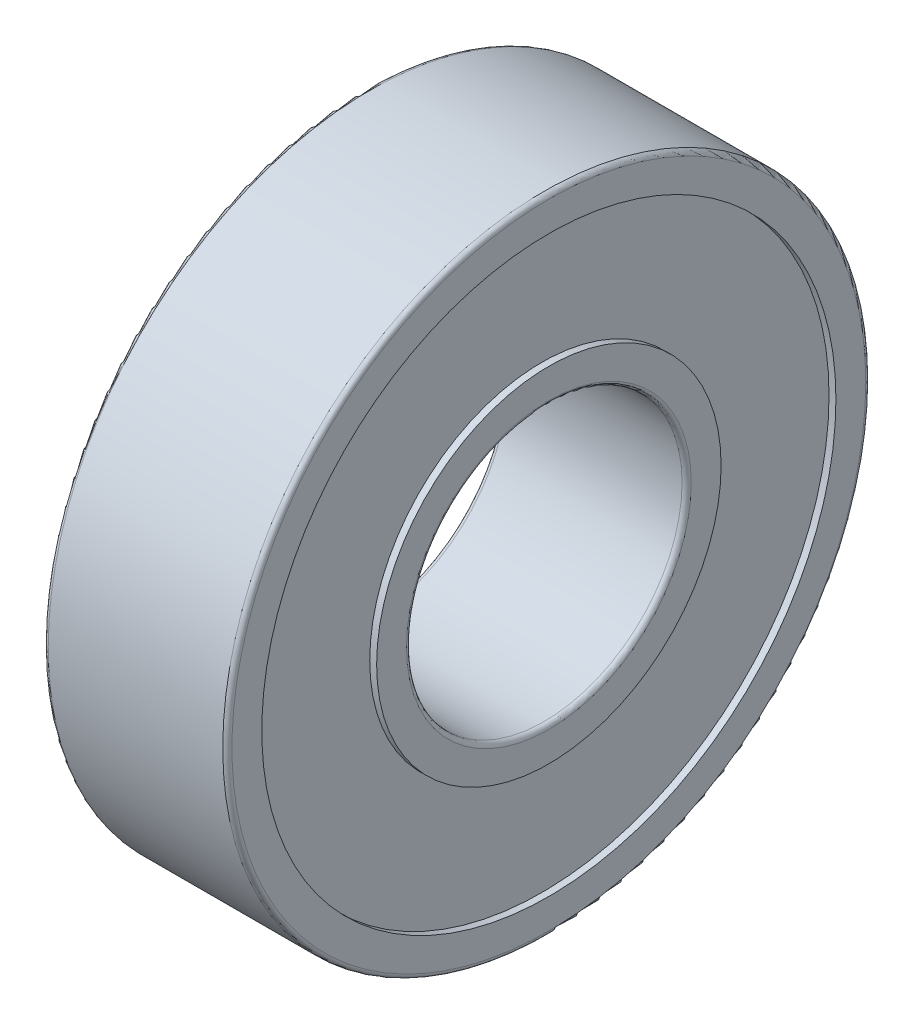
ISO-10303-21;
HEADER;
FILE_DESCRIPTION(('STEP AP214'),'2;1');
FILE_NAME('part.step','',(''),(''),'','','');
FILE_SCHEMA(('AUTOMOTIVE_DESIGN { 1 0 10303 214 1 1 1 1 }'));
ENDSEC;
DATA;
#1=APPLICATION_CONTEXT('core data for automotive mechanical design processes');
#2=APPLICATION_PROTOCOL_DEFINITION('international standard','automotive_design',2000,#1);
#3=PRODUCT_CONTEXT('',#1,'mechanical');
#4=PRODUCT('Part','Part','',(#3));
#5=PRODUCT_RELATED_PRODUCT_CATEGORY('part','',(#4));
#6=PRODUCT_DEFINITION_FORMATION('','',#4);
#7=PRODUCT_DEFINITION_CONTEXT('part definition',#1,'design');
#8=PRODUCT_DEFINITION('design','',#6,#7);
#9=PRODUCT_DEFINITION_SHAPE('','',#8);
#10=(LENGTH_UNIT() NAMED_UNIT(*) SI_UNIT(.MILLI.,.METRE.));
#11=(NAMED_UNIT(*) PLANE_ANGLE_UNIT() SI_UNIT($,.RADIAN.));
#12=(NAMED_UNIT(*) SI_UNIT($,.STERADIAN.) SOLID_ANGLE_UNIT());
#13=UNCERTAINTY_MEASURE_WITH_UNIT(LENGTH_MEASURE(1.E-05),#10,'distance_accuracy_value','');
#14=(GEOMETRIC_REPRESENTATION_CONTEXT(3) GLOBAL_UNCERTAINTY_ASSIGNED_CONTEXT((#13)) GLOBAL_UNIT_ASSIGNED_CONTEXT((#10,
#11,#12)) REPRESENTATION_CONTEXT('',''));
#15=CARTESIAN_POINT('',(0.,0.,0.));
#16=DIRECTION('',(0.,0.,1.));
#17=DIRECTION('',(1.,0.,0.));
#18=AXIS2_PLACEMENT_3D('',#15,#16,#17);
#19=CARTESIAN_POINT('',(-4.,6.,0.));
#20=DIRECTION('',(-1.,0.,0.));
#21=DIRECTION('',(0.,0.,1.));
#22=AXIS2_PLACEMENT_3D('',#19,#20,#21);
#23=PLANE('',#22);
#24=CARTESIAN_POINT('',(-4.,0.,0.));
#25=DIRECTION('',(-1.,0.,0.));
#26=DIRECTION('',(0.,0.,1.));
#27=AXIS2_PLACEMENT_3D('',#24,#25,#26);
#28=CIRCLE('',#27,6.2);
#29=CARTESIAN_POINT('',(-4.,0.,6.2));
#30=VERTEX_POINT('',#29);
#31=EDGE_CURVE('E64',#30,#30,#28,.F.);
#32=ORIENTED_EDGE('',*,*,#31,.T.);
#33=EDGE_LOOP('',(#32));
#34=FACE_BOUND('',#33,.T.);
#35=CARTESIAN_POINT('',(-4.,0.,0.));
#36=DIRECTION('',(1.,0.,0.));
#37=DIRECTION('',(0.,0.,-1.));
#38=AXIS2_PLACEMENT_3D('',#35,#36,#37);
#39=CIRCLE('',#38,7.5);
#40=CARTESIAN_POINT('',(-4.,0.,-7.5));
#41=VERTEX_POINT('',#40);
#42=EDGE_CURVE('E67',#41,#41,#39,.T.);
#43=ORIENTED_EDGE('',*,*,#42,.F.);
#44=EDGE_LOOP('',(#43));
#45=FACE_BOUND('',#44,.T.);
#46=ADVANCED_FACE('F35',(#34,#45),#23,.T.);
#47=CARTESIAN_POINT('',(0.,0.,0.));
#48=DIRECTION('',(1.,0.,0.));
#49=DIRECTION('',(0.,0.,-1.));
#50=AXIS2_PLACEMENT_3D('',#47,#48,#49);
#51=CYLINDRICAL_SURFACE('',#50,7.5);
#52=ORIENTED_EDGE('',*,*,#42,.T.);
#53=EDGE_LOOP('',(#52));
#54=FACE_BOUND('',#53,.T.);
#55=CARTESIAN_POINT('',(-3.7,0.,0.));
#56=DIRECTION('',(1.,0.,0.));
#57=DIRECTION('',(0.,0.,-1.));
#58=AXIS2_PLACEMENT_3D('',#55,#56,#57);
#59=CIRCLE('',#58,7.5);
#60=CARTESIAN_POINT('',(-3.7,0.,-7.5));
#61=VERTEX_POINT('',#60);
#62=EDGE_CURVE('E70',#61,#61,#59,.T.);
#63=ORIENTED_EDGE('',*,*,#62,.F.);
#64=EDGE_LOOP('',(#63));
#65=FACE_BOUND('',#64,.T.);
#66=ADVANCED_FACE('F110',(#54,#65),#51,.T.);
#67=CARTESIAN_POINT('',(-3.7,7.5,0.));
#68=DIRECTION('',(-1.,0.,0.));
#69=DIRECTION('',(0.,0.,1.));
#70=AXIS2_PLACEMENT_3D('',#67,#68,#69);
#71=PLANE('',#70);
#72=ORIENTED_EDGE('',*,*,#62,.T.);
#73=EDGE_LOOP('',(#72));
#74=FACE_BOUND('',#73,.T.);
#75=CARTESIAN_POINT('',(-3.7,0.,0.));
#76=DIRECTION('',(1.,0.,0.));
#77=DIRECTION('',(0.,0.,-1.));
#78=AXIS2_PLACEMENT_3D('',#75,#76,#77);
#79=CIRCLE('',#78,12.5);
#80=CARTESIAN_POINT('',(-3.7,0.,-12.5));
#81=VERTEX_POINT('',#80);
#82=EDGE_CURVE('E73',#81,#81,#79,.T.);
#83=ORIENTED_EDGE('',*,*,#82,.F.);
#84=EDGE_LOOP('',(#83));
#85=FACE_BOUND('',#84,.T.);
#86=ADVANCED_FACE('F116',(#74,#85),#71,.T.);
#87=CARTESIAN_POINT('',(0.,0.,0.));
#88=DIRECTION('',(1.,0.,0.));
#89=DIRECTION('',(0.,0.,-1.));
#90=AXIS2_PLACEMENT_3D('',#87,#88,#89);
#91=CYLINDRICAL_SURFACE('',#90,12.5);
#92=ORIENTED_EDGE('',*,*,#82,.T.);
#93=EDGE_LOOP('',(#92));
#94=FACE_BOUND('',#93,.T.);
#95=CARTESIAN_POINT('',(-4.,0.,0.));
#96=DIRECTION('',(1.,0.,0.));
#97=DIRECTION('',(0.,0.,-1.));
#98=AXIS2_PLACEMENT_3D('',#95,#96,#97);
#99=CIRCLE('',#98,12.5);
#100=CARTESIAN_POINT('',(-4.,0.,-12.5));
#101=VERTEX_POINT('',#100);
#102=EDGE_CURVE('E76',#101,#101,#99,.T.);
#103=ORIENTED_EDGE('',*,*,#102,.F.);
#104=EDGE_LOOP('',(#103));
#105=FACE_BOUND('',#104,.T.);
#106=ADVANCED_FACE('F152',(#94,#105),#91,.F.);
#107=CARTESIAN_POINT('',(-4.,12.5,0.));
#108=DIRECTION('',(-1.,0.,0.));
#109=DIRECTION('',(0.,0.,1.));
#110=AXIS2_PLACEMENT_3D('',#107,#108,#109);
#111=PLANE('',#110);
#112=CARTESIAN_POINT('',(-4.,0.,0.));
#113=DIRECTION('',(-1.,0.,0.));
#114=DIRECTION('',(0.,0.,1.));
#115=AXIS2_PLACEMENT_3D('',#112,#113,#114);
#116=CIRCLE('',#115,13.8);
#117=CARTESIAN_POINT('',(-4.,0.,13.8));
#118=VERTEX_POINT('',#117);
#119=EDGE_CURVE('E42',#118,#118,#116,.T.);
#120=ORIENTED_EDGE('',*,*,#119,.T.);
#121=EDGE_LOOP('',(#120));
#122=FACE_BOUND('',#121,.T.);
#123=ORIENTED_EDGE('',*,*,#102,.T.);
#124=EDGE_LOOP('',(#123));
#125=FACE_BOUND('',#124,.T.);
#126=ADVANCED_FACE('F143',(#122,#125),#111,.T.);
#127=CARTESIAN_POINT('',(0.,0.,0.));
#128=DIRECTION('',(1.,0.,0.));
#129=DIRECTION('',(0.,0.,-1.));
#130=AXIS2_PLACEMENT_3D('',#127,#128,#129);
#131=CYLINDRICAL_SURFACE('',#130,14.);
#132=CARTESIAN_POINT('',(-3.8,0.,0.));
#133=DIRECTION('',(-1.,0.,0.));
#134=DIRECTION('',(0.,0.,1.));
#135=AXIS2_PLACEMENT_3D('',#132,#133,#134);
#136=CIRCLE('',#135,14.);
#137=CARTESIAN_POINT('',(-3.8,0.,14.));
#138=VERTEX_POINT('',#137);
#139=EDGE_CURVE('E46',#138,#138,#136,.F.);
#140=ORIENTED_EDGE('',*,*,#139,.T.);
#141=EDGE_LOOP('',(#140));
#142=FACE_BOUND('',#141,.T.);
#143=CARTESIAN_POINT('',(3.8,0.,0.));
#144=DIRECTION('',(1.,0.,0.));
#145=DIRECTION('',(0.,0.,-1.));
#146=AXIS2_PLACEMENT_3D('',#143,#144,#145);
#147=CIRCLE('',#146,14.);
#148=CARTESIAN_POINT('',(3.8,0.,-14.));
#149=VERTEX_POINT('',#148);
#150=EDGE_CURVE('E50',#149,#149,#147,.F.);
#151=ORIENTED_EDGE('',*,*,#150,.T.);
#152=EDGE_LOOP('',(#151));
#153=FACE_BOUND('',#152,.T.);
#154=ADVANCED_FACE('F139',(#142,#153),#131,.T.);
#155=CARTESIAN_POINT('',(4.,12.5,0.));
#156=DIRECTION('',(1.,0.,0.));
#157=DIRECTION('',(0.,0.,-1.));
#158=AXIS2_PLACEMENT_3D('',#155,#156,#157);
#159=PLANE('',#158);
#160=CARTESIAN_POINT('',(4.,0.,0.));
#161=DIRECTION('',(1.,0.,0.));
#162=DIRECTION('',(0.,0.,-1.));
#163=AXIS2_PLACEMENT_3D('',#160,#161,#162);
#164=CIRCLE('',#163,13.8);
#165=CARTESIAN_POINT('',(4.,0.,-13.8));
#166=VERTEX_POINT('',#165);
#167=EDGE_CURVE('E10',#166,#166,#164,.T.);
#168=ORIENTED_EDGE('',*,*,#167,.T.);
#169=EDGE_LOOP('',(#168));
#170=FACE_BOUND('',#169,.T.);
#171=CARTESIAN_POINT('',(4.,0.,0.));
#172=DIRECTION('',(1.,0.,0.));
#173=DIRECTION('',(0.,0.,-1.));
#174=AXIS2_PLACEMENT_3D('',#171,#172,#173);
#175=CIRCLE('',#174,12.5);
#176=CARTESIAN_POINT('',(4.,0.,-12.5));
#177=VERTEX_POINT('',#176);
#178=EDGE_CURVE('E79',#177,#177,#175,.T.);
#179=ORIENTED_EDGE('',*,*,#178,.F.);
#180=EDGE_LOOP('',(#179));
#181=FACE_BOUND('',#180,.T.);
#182=ADVANCED_FACE('F142',(#170,#181),#159,.T.);
#183=CARTESIAN_POINT('',(0.,0.,0.));
#184=DIRECTION('',(1.,0.,0.));
#185=DIRECTION('',(0.,0.,-1.));
#186=AXIS2_PLACEMENT_3D('',#183,#184,#185);
#187=CYLINDRICAL_SURFACE('',#186,12.5);
#188=ORIENTED_EDGE('',*,*,#178,.T.);
#189=EDGE_LOOP('',(#188));
#190=FACE_BOUND('',#189,.T.);
#191=CARTESIAN_POINT('',(3.7,0.,0.));
#192=DIRECTION('',(1.,0.,0.));
#193=DIRECTION('',(0.,0.,-1.));
#194=AXIS2_PLACEMENT_3D('',#191,#192,#193);
#195=CIRCLE('',#194,12.5);
#196=CARTESIAN_POINT('',(3.7,0.,-12.5));
#197=VERTEX_POINT('',#196);
#198=EDGE_CURVE('E82',#197,#197,#195,.T.);
#199=ORIENTED_EDGE('',*,*,#198,.F.);
#200=EDGE_LOOP('',(#199));
#201=FACE_BOUND('',#200,.T.);
#202=ADVANCED_FACE('F106',(#190,#201),#187,.F.);
#203=CARTESIAN_POINT('',(3.7,7.5,0.));
#204=DIRECTION('',(1.,0.,0.));
#205=DIRECTION('',(0.,0.,-1.));
#206=AXIS2_PLACEMENT_3D('',#203,#204,#205);
#207=PLANE('',#206);
#208=ORIENTED_EDGE('',*,*,#198,.T.);
#209=EDGE_LOOP('',(#208));
#210=FACE_BOUND('',#209,.T.);
#211=CARTESIAN_POINT('',(3.7,0.,0.));
#212=DIRECTION('',(1.,0.,0.));
#213=DIRECTION('',(0.,0.,-1.));
#214=AXIS2_PLACEMENT_3D('',#211,#212,#213);
#215=CIRCLE('',#214,7.5);
#216=CARTESIAN_POINT('',(3.7,0.,-7.5));
#217=VERTEX_POINT('',#216);
#218=EDGE_CURVE('E85',#217,#217,#215,.T.);
#219=ORIENTED_EDGE('',*,*,#218,.F.);
#220=EDGE_LOOP('',(#219));
#221=FACE_BOUND('',#220,.T.);
#222=ADVANCED_FACE('F96',(#210,#221),#207,.T.);
#223=CARTESIAN_POINT('',(0.,0.,0.));
#224=DIRECTION('',(1.,0.,0.));
#225=DIRECTION('',(0.,0.,-1.));
#226=AXIS2_PLACEMENT_3D('',#223,#224,#225);
#227=CYLINDRICAL_SURFACE('',#226,7.5);
#228=ORIENTED_EDGE('',*,*,#218,.T.);
#229=EDGE_LOOP('',(#228));
#230=FACE_BOUND('',#229,.T.);
#231=CARTESIAN_POINT('',(4.,0.,0.));
#232=DIRECTION('',(1.,0.,0.));
#233=DIRECTION('',(0.,0.,-1.));
#234=AXIS2_PLACEMENT_3D('',#231,#232,#233);
#235=CIRCLE('',#234,7.5);
#236=CARTESIAN_POINT('',(4.,0.,-7.5));
#237=VERTEX_POINT('',#236);
#238=EDGE_CURVE('E88',#237,#237,#235,.T.);
#239=ORIENTED_EDGE('',*,*,#238,.F.);
#240=EDGE_LOOP('',(#239));
#241=FACE_BOUND('',#240,.T.);
#242=ADVANCED_FACE('F94',(#230,#241),#227,.T.);
#243=CARTESIAN_POINT('',(4.,6.,0.));
#244=DIRECTION('',(1.,0.,0.));
#245=DIRECTION('',(0.,0.,-1.));
#246=AXIS2_PLACEMENT_3D('',#243,#244,#245);
#247=PLANE('',#246);
#248=CARTESIAN_POINT('',(4.,0.,0.));
#249=DIRECTION('',(1.,0.,0.));
#250=DIRECTION('',(0.,0.,-1.));
#251=AXIS2_PLACEMENT_3D('',#248,#249,#250);
#252=CIRCLE('',#251,6.2);
#253=CARTESIAN_POINT('',(4.,0.,-6.2));
#254=VERTEX_POINT('',#253);
#255=EDGE_CURVE('E55',#254,#254,#252,.F.);
#256=ORIENTED_EDGE('',*,*,#255,.T.);
#257=EDGE_LOOP('',(#256));
#258=FACE_BOUND('',#257,.T.);
#259=ORIENTED_EDGE('',*,*,#238,.T.);
#260=EDGE_LOOP('',(#259));
#261=FACE_BOUND('',#260,.T.);
#262=ADVANCED_FACE('F92',(#258,#261),#247,.T.);
#263=CARTESIAN_POINT('',(0.,0.,0.));
#264=DIRECTION('',(1.,0.,0.));
#265=DIRECTION('',(0.,0.,-1.));
#266=AXIS2_PLACEMENT_3D('',#263,#264,#265);
#267=CYLINDRICAL_SURFACE('',#266,6.);
#268=CARTESIAN_POINT('',(-3.8,0.,0.));
#269=DIRECTION('',(-1.,0.,0.));
#270=DIRECTION('',(0.,0.,1.));
#271=AXIS2_PLACEMENT_3D('',#268,#269,#270);
#272=CIRCLE('',#271,6.);
#273=CARTESIAN_POINT('',(-3.8,0.,6.));
#274=VERTEX_POINT('',#273);
#275=EDGE_CURVE('E58',#274,#274,#272,.T.);
#276=ORIENTED_EDGE('',*,*,#275,.T.);
#277=EDGE_LOOP('',(#276));
#278=FACE_BOUND('',#277,.T.);
#279=CARTESIAN_POINT('',(3.8,0.,0.));
#280=DIRECTION('',(1.,0.,0.));
#281=DIRECTION('',(0.,0.,-1.));
#282=AXIS2_PLACEMENT_3D('',#279,#280,#281);
#283=CIRCLE('',#282,6.);
#284=CARTESIAN_POINT('',(3.8,0.,-6.));
#285=VERTEX_POINT('',#284);
#286=EDGE_CURVE('E61',#285,#285,#283,.T.);
#287=ORIENTED_EDGE('',*,*,#286,.T.);
#288=EDGE_LOOP('',(#287));
#289=FACE_BOUND('',#288,.T.);
#290=ADVANCED_FACE('F103',(#278,#289),#267,.F.);
#291=CARTESIAN_POINT('',(-3.8,0.,0.));
#292=DIRECTION('',(-1.,0.,0.));
#293=DIRECTION('',(0.,0.,1.));
#294=AXIS2_PLACEMENT_3D('',#291,#292,#293);
#295=TOROIDAL_SURFACE('',#294,6.2,0.2);
#296=ORIENTED_EDGE('',*,*,#275,.F.);
#297=EDGE_LOOP('',(#296));
#298=FACE_BOUND('',#297,.T.);
#299=ORIENTED_EDGE('',*,*,#31,.F.);
#300=EDGE_LOOP('',(#299));
#301=FACE_BOUND('',#300,.T.);
#302=ADVANCED_FACE('F122',(#298,#301),#295,.T.);
#303=CARTESIAN_POINT('',(3.8,0.,0.));
#304=DIRECTION('',(1.,0.,0.));
#305=DIRECTION('',(0.,0.,-1.));
#306=AXIS2_PLACEMENT_3D('',#303,#304,#305);
#307=TOROIDAL_SURFACE('',#306,6.2,0.2);
#308=ORIENTED_EDGE('',*,*,#255,.F.);
#309=EDGE_LOOP('',(#308));
#310=FACE_BOUND('',#309,.T.);
#311=ORIENTED_EDGE('',*,*,#286,.F.);
#312=EDGE_LOOP('',(#311));
#313=FACE_BOUND('',#312,.T.);
#314=ADVANCED_FACE('F125',(#310,#313),#307,.T.);
#315=CARTESIAN_POINT('',(-3.8,0.,0.));
#316=DIRECTION('',(-1.,0.,0.));
#317=DIRECTION('',(0.,0.,1.));
#318=AXIS2_PLACEMENT_3D('',#315,#316,#317);
#319=TOROIDAL_SURFACE('',#318,13.8,0.2);
#320=ORIENTED_EDGE('',*,*,#119,.F.);
#321=EDGE_LOOP('',(#320));
#322=FACE_BOUND('',#321,.T.);
#323=ORIENTED_EDGE('',*,*,#139,.F.);
#324=EDGE_LOOP('',(#323));
#325=FACE_BOUND('',#324,.T.);
#326=ADVANCED_FACE('F128',(#322,#325),#319,.T.);
#327=CARTESIAN_POINT('',(3.8,0.,0.));
#328=DIRECTION('',(1.,0.,0.));
#329=DIRECTION('',(0.,0.,-1.));
#330=AXIS2_PLACEMENT_3D('',#327,#328,#329);
#331=TOROIDAL_SURFACE('',#330,13.8,0.2);
#332=ORIENTED_EDGE('',*,*,#150,.F.);
#333=EDGE_LOOP('',(#332));
#334=FACE_BOUND('',#333,.T.);
#335=ORIENTED_EDGE('',*,*,#167,.F.);
#336=EDGE_LOOP('',(#335));
#337=FACE_BOUND('',#336,.T.);
#338=ADVANCED_FACE('F37',(#334,#337),#331,.T.);
#339=CLOSED_SHELL('',(#46,#66,#86,#106,#126,#154,#182,#202,#222,#242,#262,#290,#302,#314,#326,#338));
#340=MANIFOLD_SOLID_BREP('B2',#339);
#341=ADVANCED_BREP_SHAPE_REPRESENTATION('',(#18,#340),#14);
#342=SHAPE_DEFINITION_REPRESENTATION(#9,#341);
ENDSEC;
END-ISO-10303-21;
